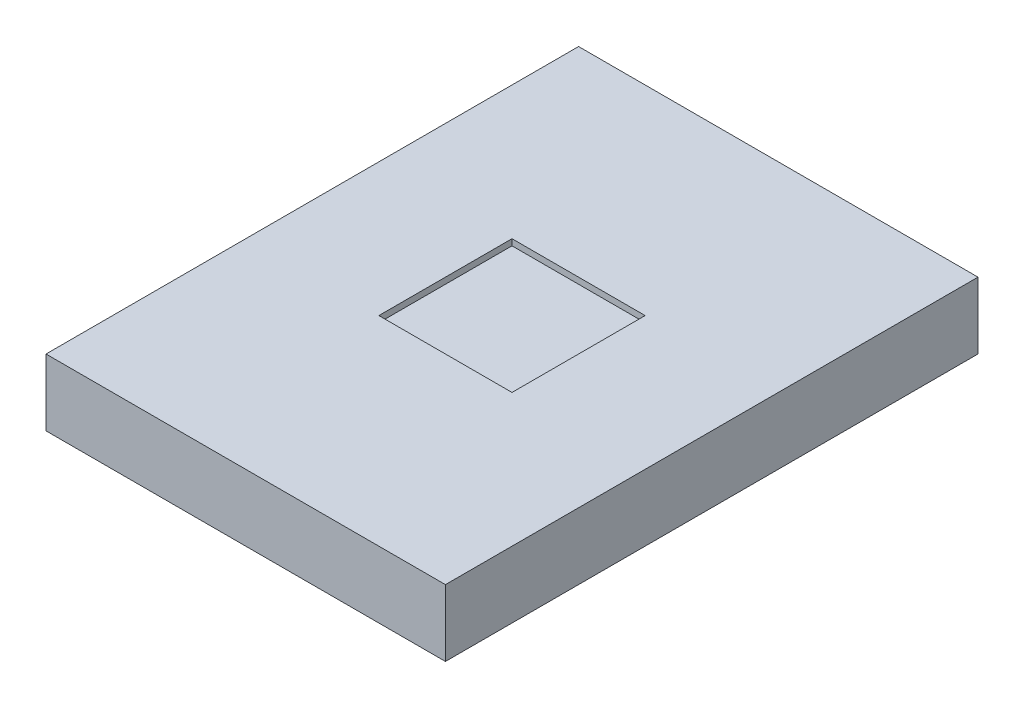
ISO-10303-21;
HEADER;
FILE_DESCRIPTION(('STEP AP214'),'2;1');
FILE_NAME('part.step','',(''),(''),'','','');
FILE_SCHEMA(('AUTOMOTIVE_DESIGN { 1 0 10303 214 1 1 1 1 }'));
ENDSEC;
DATA;
#1=APPLICATION_CONTEXT('core data for automotive mechanical design processes');
#2=APPLICATION_PROTOCOL_DEFINITION('international standard','automotive_design',2000,#1);
#3=PRODUCT_CONTEXT('',#1,'mechanical');
#4=PRODUCT('Part','Part','',(#3));
#5=PRODUCT_RELATED_PRODUCT_CATEGORY('part','',(#4));
#6=PRODUCT_DEFINITION_FORMATION('','',#4);
#7=PRODUCT_DEFINITION_CONTEXT('part definition',#1,'design');
#8=PRODUCT_DEFINITION('design','',#6,#7);
#9=PRODUCT_DEFINITION_SHAPE('','',#8);
#10=(LENGTH_UNIT() NAMED_UNIT(*) SI_UNIT(.MILLI.,.METRE.));
#11=(NAMED_UNIT(*) PLANE_ANGLE_UNIT() SI_UNIT($,.RADIAN.));
#12=(NAMED_UNIT(*) SI_UNIT($,.STERADIAN.) SOLID_ANGLE_UNIT());
#13=UNCERTAINTY_MEASURE_WITH_UNIT(LENGTH_MEASURE(1.E-05),#10,'distance_accuracy_value','');
#14=(GEOMETRIC_REPRESENTATION_CONTEXT(3) GLOBAL_UNCERTAINTY_ASSIGNED_CONTEXT((#13)) GLOBAL_UNIT_ASSIGNED_CONTEXT((#10,
#11,#12)) REPRESENTATION_CONTEXT('',''));
#15=CARTESIAN_POINT('',(0.,0.,0.));
#16=DIRECTION('',(0.,0.,1.));
#17=DIRECTION('',(1.,0.,0.));
#18=AXIS2_PLACEMENT_3D('',#15,#16,#17);
#19=CARTESIAN_POINT('',(-16.0093790289194,5.,19.7247148102947));
#20=DIRECTION('',(1.,0.,0.));
#21=DIRECTION('',(0.,0.,-1.));
#22=AXIS2_PLACEMENT_3D('',#19,#20,#21);
#23=PLANE('',#22);
#24=DIRECTION('',(0.,0.,1.));
#25=VECTOR('',#24,1.);
#26=CARTESIAN_POINT('',(-16.0093790289194,0.,19.7247148102947));
#27=LINE('',#26,#25);
#28=CARTESIAN_POINT('',(-16.0093790289194,0.,-20.2752851897053));
#29=VERTEX_POINT('',#28);
#30=CARTESIAN_POINT('',(-16.0093790289194,0.,19.7247148102947));
#31=VERTEX_POINT('',#30);
#32=EDGE_CURVE('E157',#29,#31,#27,.T.);
#33=ORIENTED_EDGE('',*,*,#32,.T.);
#34=DIRECTION('',(0.,-1.,0.));
#35=VECTOR('',#34,1.);
#36=CARTESIAN_POINT('',(-16.0093790289194,5.,19.7247148102947));
#37=LINE('',#36,#35);
#38=CARTESIAN_POINT('',(-16.0093790289194,5.,19.7247148102947));
#39=VERTEX_POINT('',#38);
#40=EDGE_CURVE('E11',#39,#31,#37,.T.);
#41=ORIENTED_EDGE('',*,*,#40,.F.);
#42=DIRECTION('',(0.,0.,1.));
#43=VECTOR('',#42,1.);
#44=CARTESIAN_POINT('',(-16.0093790289194,5.,19.7247148102947));
#45=LINE('',#44,#43);
#46=CARTESIAN_POINT('',(-16.0093790289194,5.,-20.2752851897053));
#47=VERTEX_POINT('',#46);
#48=EDGE_CURVE('E163',#47,#39,#45,.T.);
#49=ORIENTED_EDGE('',*,*,#48,.F.);
#50=DIRECTION('',(0.,-1.,0.));
#51=VECTOR('',#50,1.);
#52=CARTESIAN_POINT('',(-16.0093790289194,5.,-20.2752851897053));
#53=LINE('',#52,#51);
#54=EDGE_CURVE('E173',#47,#29,#53,.T.);
#55=ORIENTED_EDGE('',*,*,#54,.T.);
#56=EDGE_LOOP('',(#33,#41,#49,#55));
#57=FACE_BOUND('',#56,.T.);
#58=ADVANCED_FACE('F38',(#57),#23,.F.);
#59=CARTESIAN_POINT('',(-16.0093790289194,5.,19.7247148102947));
#60=DIRECTION('',(0.,0.,-1.));
#61=DIRECTION('',(-1.,0.,0.));
#62=AXIS2_PLACEMENT_3D('',#59,#60,#61);
#63=PLANE('',#62);
#64=DIRECTION('',(1.,0.,0.));
#65=VECTOR('',#64,1.);
#66=CARTESIAN_POINT('',(-16.0093790289194,0.,19.7247148102947));
#67=LINE('',#66,#65);
#68=CARTESIAN_POINT('',(13.9906209710806,0.,19.7247148102947));
#69=VERTEX_POINT('',#68);
#70=EDGE_CURVE('E177',#31,#69,#67,.T.);
#71=ORIENTED_EDGE('',*,*,#70,.T.);
#72=DIRECTION('',(0.,-1.,0.));
#73=VECTOR('',#72,1.);
#74=CARTESIAN_POINT('',(13.9906209710806,5.,19.7247148102947));
#75=LINE('',#74,#73);
#76=CARTESIAN_POINT('',(13.9906209710806,5.,19.7247148102947));
#77=VERTEX_POINT('',#76);
#78=EDGE_CURVE('E46',#77,#69,#75,.T.);
#79=ORIENTED_EDGE('',*,*,#78,.F.);
#80=DIRECTION('',(1.,0.,0.));
#81=VECTOR('',#80,1.);
#82=CARTESIAN_POINT('',(-16.0093790289194,5.,19.7247148102947));
#83=LINE('',#82,#81);
#84=EDGE_CURVE('E90',#39,#77,#83,.T.);
#85=ORIENTED_EDGE('',*,*,#84,.F.);
#86=ORIENTED_EDGE('',*,*,#40,.T.);
#87=EDGE_LOOP('',(#71,#79,#85,#86));
#88=FACE_BOUND('',#87,.T.);
#89=ADVANCED_FACE('F212',(#88),#63,.F.);
#90=CARTESIAN_POINT('',(13.9906209710806,5.,19.7247148102947));
#91=DIRECTION('',(-1.,0.,0.));
#92=DIRECTION('',(0.,0.,1.));
#93=AXIS2_PLACEMENT_3D('',#90,#91,#92);
#94=PLANE('',#93);
#95=DIRECTION('',(0.,0.,-1.));
#96=VECTOR('',#95,1.);
#97=CARTESIAN_POINT('',(13.9906209710806,0.,19.7247148102947));
#98=LINE('',#97,#96);
#99=CARTESIAN_POINT('',(13.9906209710806,0.,-20.2752851897053));
#100=VERTEX_POINT('',#99);
#101=EDGE_CURVE('E180',#69,#100,#98,.T.);
#102=ORIENTED_EDGE('',*,*,#101,.T.);
#103=DIRECTION('',(0.,-1.,0.));
#104=VECTOR('',#103,1.);
#105=CARTESIAN_POINT('',(13.9906209710806,5.,-20.2752851897053));
#106=LINE('',#105,#104);
#107=CARTESIAN_POINT('',(13.9906209710806,5.,-20.2752851897053));
#108=VERTEX_POINT('',#107);
#109=EDGE_CURVE('E187',#108,#100,#106,.T.);
#110=ORIENTED_EDGE('',*,*,#109,.F.);
#111=DIRECTION('',(0.,0.,-1.));
#112=VECTOR('',#111,1.);
#113=CARTESIAN_POINT('',(13.9906209710806,5.,19.7247148102947));
#114=LINE('',#113,#112);
#115=EDGE_CURVE('E168',#77,#108,#114,.T.);
#116=ORIENTED_EDGE('',*,*,#115,.F.);
#117=ORIENTED_EDGE('',*,*,#78,.T.);
#118=EDGE_LOOP('',(#102,#110,#116,#117));
#119=FACE_BOUND('',#118,.T.);
#120=ADVANCED_FACE('F194',(#119),#94,.F.);
#121=CARTESIAN_POINT('',(-16.0093790289194,5.,-20.2752851897053));
#122=DIRECTION('',(0.,0.,1.));
#123=DIRECTION('',(1.,0.,0.));
#124=AXIS2_PLACEMENT_3D('',#121,#122,#123);
#125=PLANE('',#124);
#126=DIRECTION('',(-1.,0.,0.));
#127=VECTOR('',#126,1.);
#128=CARTESIAN_POINT('',(-16.0093790289194,0.,-20.2752851897053));
#129=LINE('',#128,#127);
#130=EDGE_CURVE('E83',#100,#29,#129,.T.);
#131=ORIENTED_EDGE('',*,*,#130,.T.);
#132=ORIENTED_EDGE('',*,*,#54,.F.);
#133=DIRECTION('',(-1.,0.,0.));
#134=VECTOR('',#133,1.);
#135=CARTESIAN_POINT('',(-16.0093790289194,5.,-20.2752851897053));
#136=LINE('',#135,#134);
#137=EDGE_CURVE('E62',#108,#47,#136,.T.);
#138=ORIENTED_EDGE('',*,*,#137,.F.);
#139=ORIENTED_EDGE('',*,*,#109,.T.);
#140=EDGE_LOOP('',(#131,#132,#138,#139));
#141=FACE_BOUND('',#140,.T.);
#142=ADVANCED_FACE('F202',(#141),#125,.F.);
#143=CARTESIAN_POINT('',(0.,5.,0.));
#144=DIRECTION('',(0.,-1.,0.));
#145=DIRECTION('',(0.,0.,-1.));
#146=AXIS2_PLACEMENT_3D('',#143,#144,#145);
#147=PLANE('',#146);
#148=DIRECTION('',(1.,0.,0.));
#149=VECTOR('',#148,1.);
#150=CARTESIAN_POINT('',(-6.00937902891936,5.,4.72471481029472));
#151=LINE('',#150,#149);
#152=CARTESIAN_POINT('',(-6.00937902891936,5.,4.72471481029472));
#153=VERTEX_POINT('',#152);
#154=CARTESIAN_POINT('',(3.99062097108064,5.,4.72471481029472));
#155=VERTEX_POINT('',#154);
#156=EDGE_CURVE('E148',#153,#155,#151,.T.);
#157=ORIENTED_EDGE('',*,*,#156,.F.);
#158=DIRECTION('',(0.,0.,1.));
#159=VECTOR('',#158,1.);
#160=CARTESIAN_POINT('',(-6.00937902891936,5.,-5.27528518970528));
#161=LINE('',#160,#159);
#162=CARTESIAN_POINT('',(-6.00937902891936,5.,-5.27528518970528));
#163=VERTEX_POINT('',#162);
#164=EDGE_CURVE('E53',#163,#153,#161,.T.);
#165=ORIENTED_EDGE('',*,*,#164,.F.);
#166=DIRECTION('',(-1.,0.,0.));
#167=VECTOR('',#166,1.);
#168=CARTESIAN_POINT('',(-6.00937902891936,5.,-5.27528518970528));
#169=LINE('',#168,#167);
#170=CARTESIAN_POINT('',(3.99062097108064,5.,-5.27528518970528));
#171=VERTEX_POINT('',#170);
#172=EDGE_CURVE('E135',#171,#163,#169,.T.);
#173=ORIENTED_EDGE('',*,*,#172,.F.);
#174=DIRECTION('',(0.,0.,-1.));
#175=VECTOR('',#174,1.);
#176=CARTESIAN_POINT('',(3.99062097108064,5.,-5.27528518970528));
#177=LINE('',#176,#175);
#178=EDGE_CURVE('E139',#155,#171,#177,.T.);
#179=ORIENTED_EDGE('',*,*,#178,.F.);
#180=EDGE_LOOP('',(#157,#165,#173,#179));
#181=FACE_BOUND('',#180,.T.);
#182=ORIENTED_EDGE('',*,*,#48,.T.);
#183=ORIENTED_EDGE('',*,*,#84,.T.);
#184=ORIENTED_EDGE('',*,*,#115,.T.);
#185=ORIENTED_EDGE('',*,*,#137,.T.);
#186=EDGE_LOOP('',(#182,#183,#184,#185));
#187=FACE_BOUND('',#186,.T.);
#188=ADVANCED_FACE('F204',(#181,#187),#147,.F.);
#189=CARTESIAN_POINT('',(0.,0.,0.));
#190=DIRECTION('',(0.,-1.,0.));
#191=DIRECTION('',(0.,0.,-1.));
#192=AXIS2_PLACEMENT_3D('',#189,#190,#191);
#193=PLANE('',#192);
#194=ORIENTED_EDGE('',*,*,#32,.F.);
#195=ORIENTED_EDGE('',*,*,#130,.F.);
#196=ORIENTED_EDGE('',*,*,#101,.F.);
#197=ORIENTED_EDGE('',*,*,#70,.F.);
#198=EDGE_LOOP('',(#194,#195,#196,#197));
#199=FACE_BOUND('',#198,.T.);
#200=ADVANCED_FACE('F198',(#199),#193,.T.);
#201=CARTESIAN_POINT('',(-6.00937902891936,4.535,-5.27528518970528));
#202=DIRECTION('',(-1.,0.,0.));
#203=DIRECTION('',(0.,0.,1.));
#204=AXIS2_PLACEMENT_3D('',#201,#202,#203);
#205=PLANE('',#204);
#206=ORIENTED_EDGE('',*,*,#164,.T.);
#207=DIRECTION('',(0.,1.,0.));
#208=VECTOR('',#207,1.);
#209=CARTESIAN_POINT('',(-6.00937902891936,4.535,4.72471481029472));
#210=LINE('',#209,#208);
#211=CARTESIAN_POINT('',(-6.00937902891936,4.535,4.72471481029472));
#212=VERTEX_POINT('',#211);
#213=EDGE_CURVE('E110',#212,#153,#210,.T.);
#214=ORIENTED_EDGE('',*,*,#213,.F.);
#215=DIRECTION('',(0.,0.,1.));
#216=VECTOR('',#215,1.);
#217=CARTESIAN_POINT('',(-6.00937902891936,4.535,-5.27528518970528));
#218=LINE('',#217,#216);
#219=CARTESIAN_POINT('',(-6.00937902891936,4.535,-5.27528518970528));
#220=VERTEX_POINT('',#219);
#221=EDGE_CURVE('E114',#220,#212,#218,.T.);
#222=ORIENTED_EDGE('',*,*,#221,.F.);
#223=DIRECTION('',(0.,1.,0.));
#224=VECTOR('',#223,1.);
#225=CARTESIAN_POINT('',(-6.00937902891936,4.535,-5.27528518970528));
#226=LINE('',#225,#224);
#227=EDGE_CURVE('E154',#220,#163,#226,.T.);
#228=ORIENTED_EDGE('',*,*,#227,.T.);
#229=EDGE_LOOP('',(#206,#214,#222,#228));
#230=FACE_BOUND('',#229,.T.);
#231=ADVANCED_FACE('F112',(#230),#205,.F.);
#232=CARTESIAN_POINT('',(-6.00937902891936,4.535,-5.27528518970528));
#233=DIRECTION('',(0.,0.,-1.));
#234=DIRECTION('',(-1.,0.,0.));
#235=AXIS2_PLACEMENT_3D('',#232,#233,#234);
#236=PLANE('',#235);
#237=ORIENTED_EDGE('',*,*,#172,.T.);
#238=ORIENTED_EDGE('',*,*,#227,.F.);
#239=DIRECTION('',(-1.,0.,0.));
#240=VECTOR('',#239,1.);
#241=CARTESIAN_POINT('',(-6.00937902891936,4.535,-5.27528518970528));
#242=LINE('',#241,#240);
#243=CARTESIAN_POINT('',(3.99062097108064,4.535,-5.27528518970528));
#244=VERTEX_POINT('',#243);
#245=EDGE_CURVE('E121',#244,#220,#242,.T.);
#246=ORIENTED_EDGE('',*,*,#245,.F.);
#247=DIRECTION('',(0.,1.,0.));
#248=VECTOR('',#247,1.);
#249=CARTESIAN_POINT('',(3.99062097108064,4.535,-5.27528518970528));
#250=LINE('',#249,#248);
#251=EDGE_CURVE('E158',#244,#171,#250,.T.);
#252=ORIENTED_EDGE('',*,*,#251,.T.);
#253=EDGE_LOOP('',(#237,#238,#246,#252));
#254=FACE_BOUND('',#253,.T.);
#255=ADVANCED_FACE('F251',(#254),#236,.F.);
#256=CARTESIAN_POINT('',(3.99062097108064,4.535,-5.27528518970528));
#257=DIRECTION('',(1.,0.,0.));
#258=DIRECTION('',(0.,0.,-1.));
#259=AXIS2_PLACEMENT_3D('',#256,#257,#258);
#260=PLANE('',#259);
#261=ORIENTED_EDGE('',*,*,#178,.T.);
#262=ORIENTED_EDGE('',*,*,#251,.F.);
#263=DIRECTION('',(0.,0.,-1.));
#264=VECTOR('',#263,1.);
#265=CARTESIAN_POINT('',(3.99062097108064,4.535,-5.27528518970528));
#266=LINE('',#265,#264);
#267=CARTESIAN_POINT('',(3.99062097108064,4.535,4.72471481029472));
#268=VERTEX_POINT('',#267);
#269=EDGE_CURVE('E130',#268,#244,#266,.T.);
#270=ORIENTED_EDGE('',*,*,#269,.F.);
#271=DIRECTION('',(0.,1.,0.));
#272=VECTOR('',#271,1.);
#273=CARTESIAN_POINT('',(3.99062097108064,4.535,4.72471481029472));
#274=LINE('',#273,#272);
#275=EDGE_CURVE('E120',#268,#155,#274,.T.);
#276=ORIENTED_EDGE('',*,*,#275,.T.);
#277=EDGE_LOOP('',(#261,#262,#270,#276));
#278=FACE_BOUND('',#277,.T.);
#279=ADVANCED_FACE('F260',(#278),#260,.F.);
#280=CARTESIAN_POINT('',(-6.00937902891936,4.535,4.72471481029472));
#281=DIRECTION('',(0.,0.,1.));
#282=DIRECTION('',(1.,0.,0.));
#283=AXIS2_PLACEMENT_3D('',#280,#281,#282);
#284=PLANE('',#283);
#285=ORIENTED_EDGE('',*,*,#156,.T.);
#286=ORIENTED_EDGE('',*,*,#275,.F.);
#287=DIRECTION('',(1.,0.,0.));
#288=VECTOR('',#287,1.);
#289=CARTESIAN_POINT('',(-6.00937902891936,4.535,4.72471481029472));
#290=LINE('',#289,#288);
#291=EDGE_CURVE('E124',#212,#268,#290,.T.);
#292=ORIENTED_EDGE('',*,*,#291,.F.);
#293=ORIENTED_EDGE('',*,*,#213,.T.);
#294=EDGE_LOOP('',(#285,#286,#292,#293));
#295=FACE_BOUND('',#294,.T.);
#296=ADVANCED_FACE('F125',(#295),#284,.F.);
#297=CARTESIAN_POINT('',(0.,4.535,0.));
#298=DIRECTION('',(0.,1.,0.));
#299=DIRECTION('',(0.,0.,1.));
#300=AXIS2_PLACEMENT_3D('',#297,#298,#299);
#301=PLANE('',#300);
#302=ORIENTED_EDGE('',*,*,#221,.T.);
#303=ORIENTED_EDGE('',*,*,#291,.T.);
#304=ORIENTED_EDGE('',*,*,#269,.T.);
#305=ORIENTED_EDGE('',*,*,#245,.T.);
#306=EDGE_LOOP('',(#302,#303,#304,#305));
#307=FACE_BOUND('',#306,.T.);
#308=ADVANCED_FACE('F132',(#307),#301,.T.);
#309=CLOSED_SHELL('',(#58,#89,#120,#142,#188,#200,#231,#255,#279,#296,#308));
#310=MANIFOLD_SOLID_BREP('B2',#309);
#311=ADVANCED_BREP_SHAPE_REPRESENTATION('',(#18,#310),#14);
#312=SHAPE_DEFINITION_REPRESENTATION(#9,#311);
ENDSEC;
END-ISO-10303-21;
